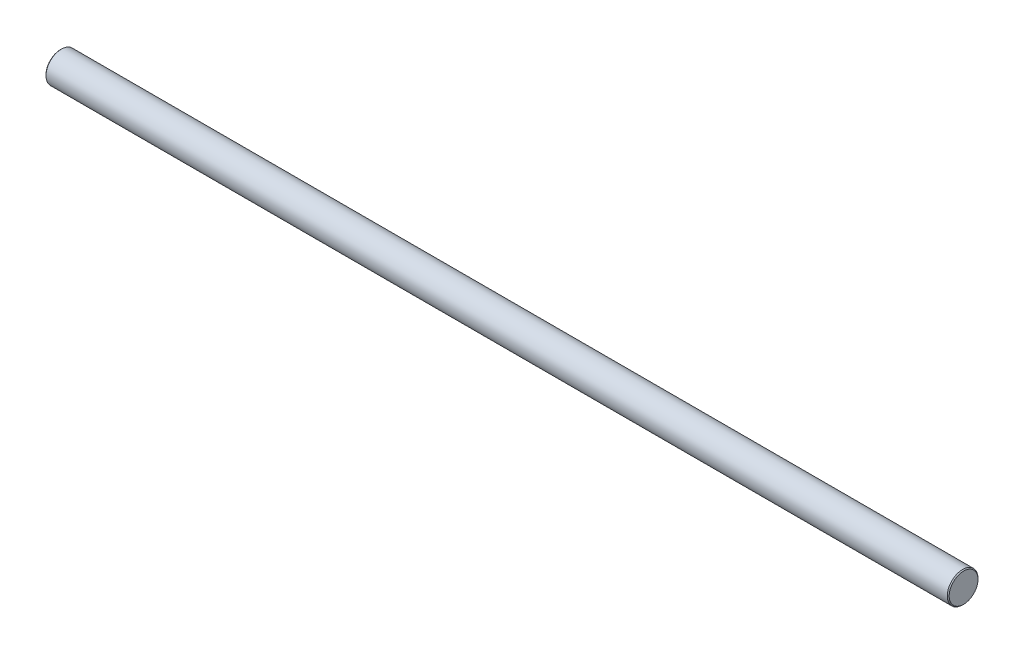
ISO-10303-21;
HEADER;
FILE_DESCRIPTION(('STEP AP214'),'2;1');
FILE_NAME('part.step','',(''),(''),'','','');
FILE_SCHEMA(('AUTOMOTIVE_DESIGN { 1 0 10303 214 1 1 1 1 }'));
ENDSEC;
DATA;
#1=APPLICATION_CONTEXT('core data for automotive mechanical design processes');
#2=APPLICATION_PROTOCOL_DEFINITION('international standard','automotive_design',2000,#1);
#3=PRODUCT_CONTEXT('',#1,'mechanical');
#4=PRODUCT('Part','Part','',(#3));
#5=PRODUCT_RELATED_PRODUCT_CATEGORY('part','',(#4));
#6=PRODUCT_DEFINITION_FORMATION('','',#4);
#7=PRODUCT_DEFINITION_CONTEXT('part definition',#1,'design');
#8=PRODUCT_DEFINITION('design','',#6,#7);
#9=PRODUCT_DEFINITION_SHAPE('','',#8);
#10=(LENGTH_UNIT() NAMED_UNIT(*) SI_UNIT(.MILLI.,.METRE.));
#11=(NAMED_UNIT(*) PLANE_ANGLE_UNIT() SI_UNIT($,.RADIAN.));
#12=(NAMED_UNIT(*) SI_UNIT($,.STERADIAN.) SOLID_ANGLE_UNIT());
#13=UNCERTAINTY_MEASURE_WITH_UNIT(LENGTH_MEASURE(1.E-05),#10,'distance_accuracy_value','');
#14=(GEOMETRIC_REPRESENTATION_CONTEXT(3) GLOBAL_UNCERTAINTY_ASSIGNED_CONTEXT((#13)) GLOBAL_UNIT_ASSIGNED_CONTEXT((#10,
#11,#12)) REPRESENTATION_CONTEXT('',''));
#15=CARTESIAN_POINT('',(0.,0.,0.));
#16=DIRECTION('',(0.,0.,1.));
#17=DIRECTION('',(1.,0.,0.));
#18=AXIS2_PLACEMENT_3D('',#15,#16,#17);
#19=CARTESIAN_POINT('',(117.5,0.,0.));
#20=DIRECTION('',(-1.,0.,0.));
#21=DIRECTION('',(0.,0.,1.));
#22=AXIS2_PLACEMENT_3D('',#19,#20,#21);
#23=CYLINDRICAL_SURFACE('',#22,4.);
#24=CARTESIAN_POINT('',(117.25,0.,0.));
#25=DIRECTION('',(1.,0.,0.));
#26=DIRECTION('',(0.,0.,-1.));
#27=AXIS2_PLACEMENT_3D('',#24,#25,#26);
#28=CIRCLE('',#27,4.);
#29=CARTESIAN_POINT('',(117.25,0.,4.));
#30=VERTEX_POINT('',#29);
#31=EDGE_CURVE('E45',#30,#30,#28,.F.);
#32=CARTESIAN_POINT('',(-117.25,0.,0.));
#33=DIRECTION('',(1.,0.,0.));
#34=DIRECTION('',(0.,0.,-1.));
#35=AXIS2_PLACEMENT_3D('',#32,#33,#34);
#36=CIRCLE('',#35,4.);
#37=CARTESIAN_POINT('',(-117.25,0.,4.));
#38=VERTEX_POINT('',#37);
#39=EDGE_CURVE('E50',#38,#38,#36,.T.);
#40=CARTESIAN_POINT('',(117.25,0.,4.));
#41=CARTESIAN_POINT('',(114.807291666667,0.,4.));
#42=CARTESIAN_POINT('',(112.364583333333,0.,4.));
#43=CARTESIAN_POINT('',(107.479166666667,0.,4.));
#44=CARTESIAN_POINT('',(105.036458333333,0.,4.));
#45=CARTESIAN_POINT('',(100.151041666667,0.,4.));
#46=CARTESIAN_POINT('',(97.7083333333334,0.,4.));
#47=CARTESIAN_POINT('',(92.8229166666668,0.,4.));
#48=CARTESIAN_POINT('',(90.3802083333334,0.,4.));
#49=CARTESIAN_POINT('',(85.4947916666668,0.,4.));
#50=CARTESIAN_POINT('',(83.0520833333334,0.,4.));
#51=CARTESIAN_POINT('',(78.1666666666668,0.,4.));
#52=CARTESIAN_POINT('',(75.7239583333334,0.,4.));
#53=CARTESIAN_POINT('',(70.8385416666668,0.,4.));
#54=CARTESIAN_POINT('',(68.3958333333334,0.,4.));
#55=CARTESIAN_POINT('',(63.5104166666667,0.,4.));
#56=CARTESIAN_POINT('',(61.0677083333334,0.,4.));
#57=CARTESIAN_POINT('',(56.1822916666668,0.,4.));
#58=CARTESIAN_POINT('',(53.7395833333334,0.,4.));
#59=CARTESIAN_POINT('',(48.8541666666668,0.,4.));
#60=CARTESIAN_POINT('',(46.4114583333334,0.,4.));
#61=CARTESIAN_POINT('',(41.5260416666668,0.,4.));
#62=CARTESIAN_POINT('',(39.0833333333334,0.,4.));
#63=CARTESIAN_POINT('',(34.1979166666668,0.,4.));
#64=CARTESIAN_POINT('',(31.7552083333334,0.,4.));
#65=CARTESIAN_POINT('',(26.8697916666668,0.,4.));
#66=CARTESIAN_POINT('',(24.4270833333334,0.,4.));
#67=CARTESIAN_POINT('',(19.5416666666668,0.,4.));
#68=CARTESIAN_POINT('',(17.0989583333334,0.,4.));
#69=CARTESIAN_POINT('',(12.2135416666668,0.,4.));
#70=CARTESIAN_POINT('',(9.77083333333345,0.,4.));
#71=CARTESIAN_POINT('',(4.88541666666678,0.,4.));
#72=CARTESIAN_POINT('',(2.44270833333344,0.,4.));
#73=CARTESIAN_POINT('',(-2.44270833333323,0.,4.));
#74=CARTESIAN_POINT('',(-4.88541666666656,0.,4.));
#75=CARTESIAN_POINT('',(-9.77083333333323,0.,4.));
#76=CARTESIAN_POINT('',(-12.2135416666666,0.,4.));
#77=CARTESIAN_POINT('',(-17.0989583333332,0.,4.));
#78=CARTESIAN_POINT('',(-19.5416666666666,0.,4.));
#79=CARTESIAN_POINT('',(-24.4270833333332,0.,4.));
#80=CARTESIAN_POINT('',(-26.8697916666666,0.,4.));
#81=CARTESIAN_POINT('',(-31.7552083333332,0.,4.));
#82=CARTESIAN_POINT('',(-34.1979166666666,0.,4.));
#83=CARTESIAN_POINT('',(-39.0833333333332,0.,4.));
#84=CARTESIAN_POINT('',(-41.5260416666666,0.,4.));
#85=CARTESIAN_POINT('',(-46.4114583333332,0.,4.));
#86=CARTESIAN_POINT('',(-48.8541666666666,0.,4.));
#87=CARTESIAN_POINT('',(-53.7395833333332,0.,4.));
#88=CARTESIAN_POINT('',(-56.1822916666666,0.,4.));
#89=CARTESIAN_POINT('',(-61.0677083333332,0.,4.));
#90=CARTESIAN_POINT('',(-63.5104166666666,0.,4.));
#91=CARTESIAN_POINT('',(-68.3958333333332,0.,4.));
#92=CARTESIAN_POINT('',(-70.8385416666665,0.,4.));
#93=CARTESIAN_POINT('',(-75.7239583333332,0.,4.));
#94=CARTESIAN_POINT('',(-78.1666666666665,0.,4.));
#95=CARTESIAN_POINT('',(-83.0520833333332,0.,4.));
#96=CARTESIAN_POINT('',(-85.4947916666666,0.,4.));
#97=CARTESIAN_POINT('',(-90.3802083333332,0.,4.));
#98=CARTESIAN_POINT('',(-92.8229166666665,0.,4.));
#99=CARTESIAN_POINT('',(-97.7083333333332,0.,4.));
#100=CARTESIAN_POINT('',(-100.151041666667,0.,4.));
#101=CARTESIAN_POINT('',(-105.036458333333,0.,4.));
#102=CARTESIAN_POINT('',(-107.479166666667,0.,4.));
#103=CARTESIAN_POINT('',(-112.364583333333,0.,4.));
#104=CARTESIAN_POINT('',(-114.807291666667,0.,4.));
#105=CARTESIAN_POINT('',(-117.25,0.,4.));
#106=B_SPLINE_CURVE_WITH_KNOTS('',3,(#40,#41,#42,#43,#44,#45,#46,#47,#48,#49,#50,#51,#52,#53,
#54,#55,#56,#57,#58,#59,#60,#61,#62,#63,#64,#65,#66,#67,#68,#69,#70,#71,#72,#73,#74,#75,#76,#77,
#78,#79,#80,#81,#82,#83,#84,#85,#86,#87,#88,#89,#90,#91,#92,#93,#94,#95,#96,#97,#98,#99,#100,
#101,#102,#103,#104,#105),.UNSPECIFIED.,.F.,.F.,(4,2,2,2,2,2,2,2,2,2,2,2,2,2,2,2,2,2,2,2,2,2,2,
2,2,2,2,2,2,2,2,2,4),(0.,7.328125,14.65625,21.984375,29.3125,36.640625,43.96875,51.296875,
58.625,65.953125,73.28125,80.609375,87.9375,95.265625,102.59375,109.921875,117.25,124.578125,
131.90625,139.234375,146.5625,153.890625,161.21875,168.546875,175.875,183.203125,190.53125,
197.859375,205.1875,212.515625,219.84375,227.171875,234.5),.UNSPECIFIED.);
#107=EDGE_CURVE('BSEAM37',#30,#38,#106,.T.);
#108=ORIENTED_EDGE('',*,*,#31,.T.);
#109=ORIENTED_EDGE('',*,*,#39,.T.);
#110=ORIENTED_EDGE('',*,*,#107,.T.);
#111=ORIENTED_EDGE('',*,*,#107,.F.);
#112=EDGE_LOOP('',(#108,#110,#109,#111));
#113=FACE_BOUND('',#112,.T.);
#114=ADVANCED_FACE('F37',(#113),#23,.T.);
#115=CARTESIAN_POINT('',(117.5,0.,0.));
#116=DIRECTION('',(1.,0.,0.));
#117=DIRECTION('',(0.,0.,-1.));
#118=AXIS2_PLACEMENT_3D('',#115,#116,#117);
#119=PLANE('',#118);
#120=CARTESIAN_POINT('',(117.5,0.,0.));
#121=DIRECTION('',(1.,0.,0.));
#122=DIRECTION('',(0.,0.,-1.));
#123=AXIS2_PLACEMENT_3D('',#120,#121,#122);
#124=CIRCLE('',#123,3.75000000000009);
#125=CARTESIAN_POINT('',(117.5,0.,-3.75000000000009));
#126=VERTEX_POINT('',#125);
#127=EDGE_CURVE('E55',#126,#126,#124,.T.);
#128=ORIENTED_EDGE('',*,*,#127,.T.);
#129=EDGE_LOOP('',(#128));
#130=FACE_BOUND('',#129,.T.);
#131=ADVANCED_FACE('F62',(#130),#119,.T.);
#132=CARTESIAN_POINT('',(-117.5,0.,0.));
#133=DIRECTION('',(1.,0.,0.));
#134=DIRECTION('',(0.,0.,-1.));
#135=AXIS2_PLACEMENT_3D('',#132,#133,#134);
#136=PLANE('',#135);
#137=CARTESIAN_POINT('',(-117.5,0.,0.));
#138=DIRECTION('',(1.,0.,0.));
#139=DIRECTION('',(0.,0.,-1.));
#140=AXIS2_PLACEMENT_3D('',#137,#138,#139);
#141=CIRCLE('',#140,3.74999999999989);
#142=CARTESIAN_POINT('',(-117.5,0.,-3.74999999999989));
#143=VERTEX_POINT('',#142);
#144=EDGE_CURVE('E10',#143,#143,#141,.F.);
#145=ORIENTED_EDGE('',*,*,#144,.T.);
#146=EDGE_LOOP('',(#145));
#147=FACE_BOUND('',#146,.T.);
#148=ADVANCED_FACE('F66',(#147),#136,.F.);
#149=CARTESIAN_POINT('',(117.5,0.,0.));
#150=DIRECTION('',(-1.,0.,0.));
#151=DIRECTION('',(0.,0.,1.));
#152=AXIS2_PLACEMENT_3D('',#149,#150,#151);
#153=CONICAL_SURFACE('',#152,3.75000000000009,0.785398163397471);
#154=ORIENTED_EDGE('',*,*,#31,.F.);
#155=EDGE_LOOP('',(#154));
#156=FACE_BOUND('',#155,.T.);
#157=ORIENTED_EDGE('',*,*,#127,.F.);
#158=EDGE_LOOP('',(#157));
#159=FACE_BOUND('',#158,.T.);
#160=ADVANCED_FACE('F64',(#156,#159),#153,.T.);
#161=CARTESIAN_POINT('',(-117.25,0.,0.));
#162=DIRECTION('',(1.,0.,0.));
#163=DIRECTION('',(0.,0.,-1.));
#164=AXIS2_PLACEMENT_3D('',#161,#162,#163);
#165=CONICAL_SURFACE('',#164,4.,0.785398163397388);
#166=ORIENTED_EDGE('',*,*,#144,.F.);
#167=EDGE_LOOP('',(#166));
#168=FACE_BOUND('',#167,.T.);
#169=ORIENTED_EDGE('',*,*,#39,.F.);
#170=EDGE_LOOP('',(#169));
#171=FACE_BOUND('',#170,.T.);
#172=ADVANCED_FACE('F39',(#168,#171),#165,.T.);
#173=CLOSED_SHELL('',(#114,#131,#148,#160,#172));
#174=MANIFOLD_SOLID_BREP('B2',#173);
#175=ADVANCED_BREP_SHAPE_REPRESENTATION('',(#18,#174),#14);
#176=SHAPE_DEFINITION_REPRESENTATION(#9,#175);
ENDSEC;
END-ISO-10303-21;
